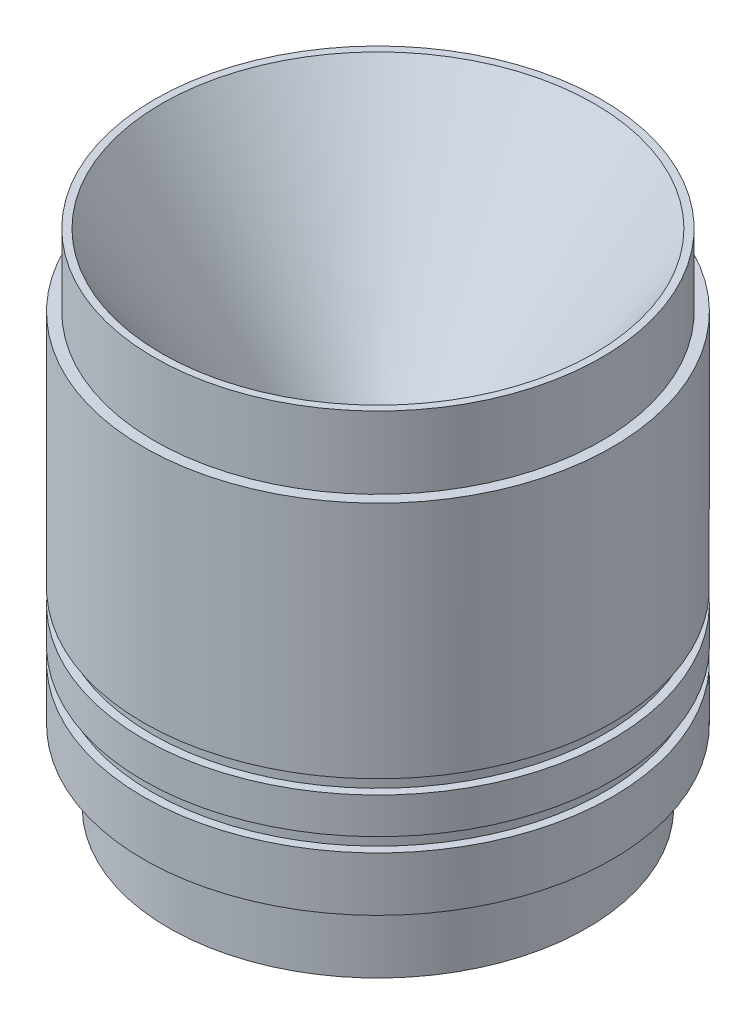
ISO-10303-21;
HEADER;
FILE_DESCRIPTION(('STEP AP214'),'2;1');
FILE_NAME('part.step','',(''),(''),'','','');
FILE_SCHEMA(('AUTOMOTIVE_DESIGN { 1 0 10303 214 1 1 1 1 }'));
ENDSEC;
DATA;
#1=APPLICATION_CONTEXT('core data for automotive mechanical design processes');
#2=APPLICATION_PROTOCOL_DEFINITION('international standard','automotive_design',2000,#1);
#3=PRODUCT_CONTEXT('',#1,'mechanical');
#4=PRODUCT('Part','Part','',(#3));
#5=PRODUCT_RELATED_PRODUCT_CATEGORY('part','',(#4));
#6=PRODUCT_DEFINITION_FORMATION('','',#4);
#7=PRODUCT_DEFINITION_CONTEXT('part definition',#1,'design');
#8=PRODUCT_DEFINITION('design','',#6,#7);
#9=PRODUCT_DEFINITION_SHAPE('','',#8);
#10=(LENGTH_UNIT() NAMED_UNIT(*) SI_UNIT(.MILLI.,.METRE.));
#11=(NAMED_UNIT(*) PLANE_ANGLE_UNIT() SI_UNIT($,.RADIAN.));
#12=(NAMED_UNIT(*) SI_UNIT($,.STERADIAN.) SOLID_ANGLE_UNIT());
#13=UNCERTAINTY_MEASURE_WITH_UNIT(LENGTH_MEASURE(1.E-05),#10,'distance_accuracy_value','');
#14=(GEOMETRIC_REPRESENTATION_CONTEXT(3) GLOBAL_UNCERTAINTY_ASSIGNED_CONTEXT((#13)) GLOBAL_UNIT_ASSIGNED_CONTEXT((#10,
#11,#12)) REPRESENTATION_CONTEXT('',''));
#15=CARTESIAN_POINT('',(0.,0.,0.));
#16=DIRECTION('',(0.,0.,1.));
#17=DIRECTION('',(1.,0.,0.));
#18=AXIS2_PLACEMENT_3D('',#15,#16,#17);
#19=CARTESIAN_POINT('',(0.,60.824555964546,0.));
#20=DIRECTION('',(0.,1.,0.));
#21=DIRECTION('',(-1.,0.,0.));
#22=AXIS2_PLACEMENT_3D('',#19,#20,#21);
#23=CYLINDRICAL_SURFACE('',#22,65.);
#24=CARTESIAN_POINT('',(0.,-54.6410161513773,0.));
#25=DIRECTION('',(0.,1.,0.));
#26=DIRECTION('',(-1.,0.,0.));
#27=AXIS2_PLACEMENT_3D('',#24,#25,#26);
#28=CIRCLE('',#27,65.);
#29=CARTESIAN_POINT('',(-65.,-54.6410161513773,0.));
#30=VERTEX_POINT('',#29);
#31=EDGE_CURVE('E77',#30,#30,#28,.T.);
#32=ORIENTED_EDGE('',*,*,#31,.T.);
#33=EDGE_LOOP('',(#32));
#34=FACE_BOUND('',#33,.T.);
#35=CARTESIAN_POINT('',(0.,-39.6410161513773,0.));
#36=DIRECTION('',(0.,1.,0.));
#37=DIRECTION('',(0.,0.,1.));
#38=AXIS2_PLACEMENT_3D('',#35,#36,#37);
#39=CIRCLE('',#38,65.);
#40=CARTESIAN_POINT('',(0.,-39.6410161513773,65.));
#41=VERTEX_POINT('',#40);
#42=EDGE_CURVE('E89',#41,#41,#39,.T.);
#43=ORIENTED_EDGE('',*,*,#42,.F.);
#44=EDGE_LOOP('',(#43));
#45=FACE_BOUND('',#44,.T.);
#46=ADVANCED_FACE('F45',(#34,#45),#23,.T.);
#47=CARTESIAN_POINT('',(0.,44.3589838486227,0.));
#48=DIRECTION('',(0.,1.,0.));
#49=DIRECTION('',(-1.,0.,0.));
#50=AXIS2_PLACEMENT_3D('',#47,#48,#49);
#51=CIRCLE('',#50,65.);
#52=CARTESIAN_POINT('',(-65.,44.3589838486227,0.));
#53=VERTEX_POINT('',#52);
#54=EDGE_CURVE('E80',#53,#53,#51,.T.);
#55=ORIENTED_EDGE('',*,*,#54,.F.);
#56=EDGE_LOOP('',(#55));
#57=FACE_BOUND('',#56,.T.);
#58=CARTESIAN_POINT('',(0.,-21.8410161513773,0.));
#59=DIRECTION('',(0.,1.,0.));
#60=DIRECTION('',(0.,0.,1.));
#61=AXIS2_PLACEMENT_3D('',#58,#59,#60);
#62=CIRCLE('',#61,65.);
#63=CARTESIAN_POINT('',(0.,-21.8410161513773,65.));
#64=VERTEX_POINT('',#63);
#65=EDGE_CURVE('E100',#64,#64,#62,.T.);
#66=ORIENTED_EDGE('',*,*,#65,.T.);
#67=EDGE_LOOP('',(#66));
#68=FACE_BOUND('',#67,.T.);
#69=ADVANCED_FACE('F128',(#57,#68),#23,.T.);
#70=CARTESIAN_POINT('',(62.,64.3589838486227,0.));
#71=DIRECTION('',(0.,-1.,0.));
#72=DIRECTION('',(1.,0.,0.));
#73=AXIS2_PLACEMENT_3D('',#70,#71,#72);
#74=PLANE('',#73);
#75=CARTESIAN_POINT('',(0.,64.3589838486227,0.));
#76=DIRECTION('',(0.,1.,0.));
#77=DIRECTION('',(-1.,0.,0.));
#78=AXIS2_PLACEMENT_3D('',#75,#76,#77);
#79=CIRCLE('',#78,60.);
#80=CARTESIAN_POINT('',(-60.,64.3589838486227,0.));
#81=VERTEX_POINT('',#80);
#82=EDGE_CURVE('E10',#81,#81,#79,.T.);
#83=ORIENTED_EDGE('',*,*,#82,.F.);
#84=EDGE_LOOP('',(#83));
#85=FACE_BOUND('',#84,.T.);
#86=CARTESIAN_POINT('',(0.,64.3589838486227,0.));
#87=DIRECTION('',(0.,1.,0.));
#88=DIRECTION('',(-1.,0.,0.));
#89=AXIS2_PLACEMENT_3D('',#86,#87,#88);
#90=CIRCLE('',#89,62.);
#91=CARTESIAN_POINT('',(-62.,64.3589838486227,0.));
#92=VERTEX_POINT('',#91);
#93=EDGE_CURVE('E86',#92,#92,#90,.T.);
#94=ORIENTED_EDGE('',*,*,#93,.T.);
#95=EDGE_LOOP('',(#94));
#96=FACE_BOUND('',#95,.T.);
#97=ADVANCED_FACE('F47',(#85,#96),#74,.F.);
#98=CARTESIAN_POINT('',(0.,64.3589838486227,0.));
#99=DIRECTION('',(0.,1.,0.));
#100=DIRECTION('',(-1.,0.,0.));
#101=AXIS2_PLACEMENT_3D('',#98,#99,#100);
#102=CONICAL_SURFACE('',#101,60.,0.610865238198017);
#103=CARTESIAN_POINT('',(0.,5.,0.));
#104=DIRECTION('',(0.,1.,0.));
#105=DIRECTION('',(-1.,0.,0.));
#106=AXIS2_PLACEMENT_3D('',#103,#104,#105);
#107=CIRCLE('',#106,18.4363920487259);
#108=CARTESIAN_POINT('',(-18.4363920487259,4.99999999999999,0.));
#109=VERTEX_POINT('',#108);
#110=EDGE_CURVE('E52',#109,#109,#107,.T.);
#111=CARTESIAN_POINT('',(-18.4363920487259,4.99999999999999,0.));
#112=CARTESIAN_POINT('',(-18.8693462982183,5.61832274842314,0.));
#113=CARTESIAN_POINT('',(-19.3023005477108,6.23664549684629,0.));
#114=CARTESIAN_POINT('',(-20.1682090466956,7.4732909936926,0.));
#115=CARTESIAN_POINT('',(-20.6011632961881,8.09161374211575,0.));
#116=CARTESIAN_POINT('',(-21.4670717951729,9.32825923896206,0.));
#117=CARTESIAN_POINT('',(-21.9000260446654,9.94658198738521,0.));
#118=CARTESIAN_POINT('',(-22.7659345436503,11.1832274842315,0.));
#119=CARTESIAN_POINT('',(-23.1988887931427,11.8015502326547,0.));
#120=CARTESIAN_POINT('',(-24.0647972921276,13.038195729501,0.));
#121=CARTESIAN_POINT('',(-24.49775154162,13.6565184779241,0.));
#122=CARTESIAN_POINT('',(-25.3636600406049,14.8931639747704,0.));
#123=CARTESIAN_POINT('',(-25.7966142900973,15.5114867231936,0.));
#124=CARTESIAN_POINT('',(-26.6625227890822,16.7481322200399,0.));
#125=CARTESIAN_POINT('',(-27.0954770385746,17.366454968463,0.));
#126=CARTESIAN_POINT('',(-27.9613855375595,18.6031004653094,0.));
#127=CARTESIAN_POINT('',(-28.394339787052,19.2214232137325,0.));
#128=CARTESIAN_POINT('',(-29.2602482860368,20.4580687105788,0.));
#129=CARTESIAN_POINT('',(-29.6932025355293,21.076391459002,0.));
#130=CARTESIAN_POINT('',(-30.5591110345142,22.3130369558483,0.));
#131=CARTESIAN_POINT('',(-30.9920652840066,22.9313597042714,0.));
#132=CARTESIAN_POINT('',(-31.8579737829915,24.1680052011177,0.));
#133=CARTESIAN_POINT('',(-32.2909280324839,24.7863279495409,0.));
#134=CARTESIAN_POINT('',(-33.1568365314688,26.0229734463872,0.));
#135=CARTESIAN_POINT('',(-33.5897907809612,26.6412961948103,0.));
#136=CARTESIAN_POINT('',(-34.4556992799461,27.8779416916567,0.));
#137=CARTESIAN_POINT('',(-34.8886535294386,28.4962644400798,0.));
#138=CARTESIAN_POINT('',(-35.7545620284234,29.7329099369261,0.));
#139=CARTESIAN_POINT('',(-36.1875162779159,30.3512326853493,0.));
#140=CARTESIAN_POINT('',(-37.0534247769007,31.5878781821956,0.));
#141=CARTESIAN_POINT('',(-37.4863790263932,32.2062009306187,0.));
#142=CARTESIAN_POINT('',(-38.3522875253781,33.442846427465,0.));
#143=CARTESIAN_POINT('',(-38.7852417748705,34.0611691758882,0.));
#144=CARTESIAN_POINT('',(-39.6511502738554,35.2978146727345,0.));
#145=CARTESIAN_POINT('',(-40.0841045233478,35.9161374211576,0.));
#146=CARTESIAN_POINT('',(-40.9500130223327,37.1527829180039,0.));
#147=CARTESIAN_POINT('',(-41.3829672718251,37.7711056664271,0.));
#148=CARTESIAN_POINT('',(-42.24887577081,39.0077511632734,0.));
#149=CARTESIAN_POINT('',(-42.6818300203025,39.6260739116966,0.));
#150=CARTESIAN_POINT('',(-43.5477385192873,40.8627194085429,0.));
#151=CARTESIAN_POINT('',(-43.9806927687798,41.481042156966,0.));
#152=CARTESIAN_POINT('',(-44.8466012677647,42.7176876538123,0.));
#153=CARTESIAN_POINT('',(-45.2795555172571,43.3360104022355,0.));
#154=CARTESIAN_POINT('',(-46.145464016242,44.5726558990818,0.));
#155=CARTESIAN_POINT('',(-46.5784182657344,45.1909786475049,0.));
#156=CARTESIAN_POINT('',(-47.4443267647193,46.4276241443512,0.));
#157=CARTESIAN_POINT('',(-47.8772810142117,47.0459468927744,0.));
#158=CARTESIAN_POINT('',(-48.7431895131966,48.2825923896207,0.));
#159=CARTESIAN_POINT('',(-49.176143762689,48.9009151380438,0.));
#160=CARTESIAN_POINT('',(-50.0420522616739,50.1375606348902,0.));
#161=CARTESIAN_POINT('',(-50.4750065111664,50.7558833833133,0.));
#162=CARTESIAN_POINT('',(-51.3409150101512,51.9925288801596,0.));
#163=CARTESIAN_POINT('',(-51.7738692596437,52.6108516285828,0.));
#164=CARTESIAN_POINT('',(-52.6397777586286,53.8474971254291,0.));
#165=CARTESIAN_POINT('',(-53.072732008121,54.4658198738522,0.));
#166=CARTESIAN_POINT('',(-53.9386405071059,55.7024653706985,0.));
#167=CARTESIAN_POINT('',(-54.3715947565983,56.3207881191217,0.));
#168=CARTESIAN_POINT('',(-55.2375032555832,57.557433615968,0.));
#169=CARTESIAN_POINT('',(-55.6704575050756,58.1757563643911,0.));
#170=CARTESIAN_POINT('',(-56.5363660040605,59.4124018612374,0.));
#171=CARTESIAN_POINT('',(-56.9693202535529,60.0307246096606,0.));
#172=CARTESIAN_POINT('',(-57.8352287525378,61.2673701065069,0.));
#173=CARTESIAN_POINT('',(-58.2681830020303,61.88569285493,0.));
#174=CARTESIAN_POINT('',(-59.1340915010151,63.1223383517763,0.));
#175=CARTESIAN_POINT('',(-59.5670457505076,63.7406611001995,0.));
#176=CARTESIAN_POINT('',(-60.,64.3589838486227,0.));
#177=B_SPLINE_CURVE_WITH_KNOTS('',3,(#111,#112,#113,#114,#115,#116,#117,#118,#119,#120,#121,
#122,#123,#124,#125,#126,#127,#128,#129,#130,#131,#132,#133,#134,#135,#136,#137,#138,#139,#140,
#141,#142,#143,#144,#145,#146,#147,#148,#149,#150,#151,#152,#153,#154,#155,#156,#157,#158,#159,
#160,#161,#162,#163,#164,#165,#166,#167,#168,#169,#170,#171,#172,#173,#174,#175,#176),
.UNSPECIFIED.,.F.,.F.,(4,2,2,2,2,2,2,2,2,2,2,2,2,2,2,2,2,2,2,2,2,2,2,2,2,2,2,2,2,2,2,2,4),(0.,
2.26449809678439,4.52899619356878,6.79349429035316,9.05799238713755,11.3224904839219,
13.5869885807063,15.8514866774907,18.1159847742751,20.3804828710595,22.6449809678439,
24.9094790646282,27.1739771614126,29.438475258197,31.7029733549814,33.9674714517658,
36.2319695485502,38.4964676453346,40.7609657421189,43.0254638389033,45.2899619356877,
47.5544600324721,49.8189581292565,52.0834562260409,54.3479543228253,56.6124524196096,
58.876950516394,61.1414486131784,63.4059467099628,65.6704448067472,67.9349429035315,
70.1994410003159,72.4639390971003),.UNSPECIFIED.);
#178=EDGE_CURVE('BSEAM210',#109,#81,#177,.T.);
#179=ORIENTED_EDGE('',*,*,#110,.F.);
#180=ORIENTED_EDGE('',*,*,#82,.T.);
#181=ORIENTED_EDGE('',*,*,#178,.T.);
#182=ORIENTED_EDGE('',*,*,#178,.F.);
#183=EDGE_LOOP('',(#179,#181,#180,#182));
#184=FACE_BOUND('',#183,.T.);
#185=ADVANCED_FACE('F210',(#184),#102,.F.);
#186=CARTESIAN_POINT('',(0.,60.824555964546,0.));
#187=DIRECTION('',(0.,1.,0.));
#188=DIRECTION('',(-1.,0.,0.));
#189=AXIS2_PLACEMENT_3D('',#186,#187,#188);
#190=CYLINDRICAL_SURFACE('',#189,18.4363920487259);
#191=CARTESIAN_POINT('',(0.,-5.,0.));
#192=DIRECTION('',(0.,1.,0.));
#193=DIRECTION('',(-1.,0.,0.));
#194=AXIS2_PLACEMENT_3D('',#191,#192,#193);
#195=CIRCLE('',#194,18.4363920487259);
#196=CARTESIAN_POINT('',(-18.4363920487259,-5.00000000000001,0.));
#197=VERTEX_POINT('',#196);
#198=EDGE_CURVE('E56',#197,#197,#195,.T.);
#199=ORIENTED_EDGE('',*,*,#198,.F.);
#200=EDGE_LOOP('',(#199));
#201=FACE_BOUND('',#200,.T.);
#202=ORIENTED_EDGE('',*,*,#110,.T.);
#203=EDGE_LOOP('',(#202));
#204=FACE_BOUND('',#203,.T.);
#205=ADVANCED_FACE('F207',(#201,#204),#190,.F.);
#206=CARTESIAN_POINT('',(0.,-5.,0.));
#207=DIRECTION('',(0.,-1.,0.));
#208=DIRECTION('',(1.,0.,0.));
#209=AXIS2_PLACEMENT_3D('',#206,#207,#208);
#210=CONICAL_SURFACE('',#209,18.4363920487259,0.26179938779915);
#211=CARTESIAN_POINT('',(0.,-79.6410161513773,0.));
#212=DIRECTION('',(0.,1.,0.));
#213=DIRECTION('',(-1.,0.,0.));
#214=AXIS2_PLACEMENT_3D('',#211,#212,#213);
#215=CIRCLE('',#214,38.4363920487259);
#216=CARTESIAN_POINT('',(-38.4363920487259,-79.6410161513773,0.));
#217=VERTEX_POINT('',#216);
#218=EDGE_CURVE('E60',#217,#217,#215,.T.);
#219=ORIENTED_EDGE('',*,*,#218,.F.);
#220=EDGE_LOOP('',(#219));
#221=FACE_BOUND('',#220,.T.);
#222=ORIENTED_EDGE('',*,*,#198,.T.);
#223=EDGE_LOOP('',(#222));
#224=FACE_BOUND('',#223,.T.);
#225=ADVANCED_FACE('F203',(#221,#224),#210,.F.);
#226=CARTESIAN_POINT('',(38.4363920487259,-79.6410161513773,0.));
#227=DIRECTION('',(0.,1.,0.));
#228=DIRECTION('',(-1.,0.,0.));
#229=AXIS2_PLACEMENT_3D('',#226,#227,#228);
#230=PLANE('',#229);
#231=CARTESIAN_POINT('',(0.,-79.6410161513773,0.));
#232=DIRECTION('',(0.,1.,0.));
#233=DIRECTION('',(-1.,0.,0.));
#234=AXIS2_PLACEMENT_3D('',#231,#232,#233);
#235=CIRCLE('',#234,48.);
#236=CARTESIAN_POINT('',(-48.,-79.6410161513773,0.));
#237=VERTEX_POINT('',#236);
#238=EDGE_CURVE('E65',#237,#237,#235,.T.);
#239=ORIENTED_EDGE('',*,*,#238,.F.);
#240=EDGE_LOOP('',(#239));
#241=FACE_BOUND('',#240,.T.);
#242=ORIENTED_EDGE('',*,*,#218,.T.);
#243=EDGE_LOOP('',(#242));
#244=FACE_BOUND('',#243,.T.);
#245=ADVANCED_FACE('F199',(#241,#244),#230,.F.);
#246=CARTESIAN_POINT('',(0.,60.824555964546,0.));
#247=DIRECTION('',(0.,1.,0.));
#248=DIRECTION('',(-1.,0.,0.));
#249=AXIS2_PLACEMENT_3D('',#246,#247,#248);
#250=CYLINDRICAL_SURFACE('',#249,48.);
#251=CARTESIAN_POINT('',(0.,-74.6410161513773,0.));
#252=DIRECTION('',(0.,1.,0.));
#253=DIRECTION('',(-1.,0.,0.));
#254=AXIS2_PLACEMENT_3D('',#251,#252,#253);
#255=CIRCLE('',#254,48.);
#256=CARTESIAN_POINT('',(-48.,-74.6410161513773,0.));
#257=VERTEX_POINT('',#256);
#258=EDGE_CURVE('E68',#257,#257,#255,.T.);
#259=ORIENTED_EDGE('',*,*,#258,.F.);
#260=EDGE_LOOP('',(#259));
#261=FACE_BOUND('',#260,.T.);
#262=ORIENTED_EDGE('',*,*,#238,.T.);
#263=EDGE_LOOP('',(#262));
#264=FACE_BOUND('',#263,.T.);
#265=ADVANCED_FACE('F195',(#261,#264),#250,.T.);
#266=CARTESIAN_POINT('',(48.,-74.6410161513773,0.));
#267=DIRECTION('',(0.,1.,0.));
#268=DIRECTION('',(-1.,0.,0.));
#269=AXIS2_PLACEMENT_3D('',#266,#267,#268);
#270=PLANE('',#269);
#271=CARTESIAN_POINT('',(0.,-74.6410161513773,0.));
#272=DIRECTION('',(0.,1.,0.));
#273=DIRECTION('',(-1.,0.,0.));
#274=AXIS2_PLACEMENT_3D('',#271,#272,#273);
#275=CIRCLE('',#274,58.);
#276=CARTESIAN_POINT('',(-58.,-74.6410161513773,0.));
#277=VERTEX_POINT('',#276);
#278=EDGE_CURVE('E71',#277,#277,#275,.T.);
#279=ORIENTED_EDGE('',*,*,#278,.F.);
#280=EDGE_LOOP('',(#279));
#281=FACE_BOUND('',#280,.T.);
#282=ORIENTED_EDGE('',*,*,#258,.T.);
#283=EDGE_LOOP('',(#282));
#284=FACE_BOUND('',#283,.T.);
#285=ADVANCED_FACE('F187',(#281,#284),#270,.F.);
#286=CARTESIAN_POINT('',(0.,60.824555964546,0.));
#287=DIRECTION('',(0.,1.,0.));
#288=DIRECTION('',(-1.,0.,0.));
#289=AXIS2_PLACEMENT_3D('',#286,#287,#288);
#290=CYLINDRICAL_SURFACE('',#289,58.);
#291=CARTESIAN_POINT('',(0.,-54.6410161513773,0.));
#292=DIRECTION('',(0.,1.,0.));
#293=DIRECTION('',(-1.,0.,0.));
#294=AXIS2_PLACEMENT_3D('',#291,#292,#293);
#295=CIRCLE('',#294,58.);
#296=CARTESIAN_POINT('',(-58.,-54.6410161513773,0.));
#297=VERTEX_POINT('',#296);
#298=EDGE_CURVE('E74',#297,#297,#295,.T.);
#299=ORIENTED_EDGE('',*,*,#298,.F.);
#300=EDGE_LOOP('',(#299));
#301=FACE_BOUND('',#300,.T.);
#302=ORIENTED_EDGE('',*,*,#278,.T.);
#303=EDGE_LOOP('',(#302));
#304=FACE_BOUND('',#303,.T.);
#305=ADVANCED_FACE('F178',(#301,#304),#290,.T.);
#306=CARTESIAN_POINT('',(58.,-54.6410161513773,0.));
#307=DIRECTION('',(0.,1.,0.));
#308=DIRECTION('',(-1.,0.,0.));
#309=AXIS2_PLACEMENT_3D('',#306,#307,#308);
#310=PLANE('',#309);
#311=ORIENTED_EDGE('',*,*,#31,.F.);
#312=EDGE_LOOP('',(#311));
#313=FACE_BOUND('',#312,.T.);
#314=ORIENTED_EDGE('',*,*,#298,.T.);
#315=EDGE_LOOP('',(#314));
#316=FACE_BOUND('',#315,.T.);
#317=ADVANCED_FACE('F173',(#313,#316),#310,.F.);
#318=CARTESIAN_POINT('',(65.,44.3589838486227,0.));
#319=DIRECTION('',(0.,-1.,0.));
#320=DIRECTION('',(1.,0.,0.));
#321=AXIS2_PLACEMENT_3D('',#318,#319,#320);
#322=PLANE('',#321);
#323=CARTESIAN_POINT('',(0.,44.3589838486227,0.));
#324=DIRECTION('',(0.,1.,0.));
#325=DIRECTION('',(-1.,0.,0.));
#326=AXIS2_PLACEMENT_3D('',#323,#324,#325);
#327=CIRCLE('',#326,62.);
#328=CARTESIAN_POINT('',(-62.,44.3589838486227,0.));
#329=VERTEX_POINT('',#328);
#330=EDGE_CURVE('E83',#329,#329,#327,.T.);
#331=ORIENTED_EDGE('',*,*,#330,.F.);
#332=EDGE_LOOP('',(#331));
#333=FACE_BOUND('',#332,.T.);
#334=ORIENTED_EDGE('',*,*,#54,.T.);
#335=EDGE_LOOP('',(#334));
#336=FACE_BOUND('',#335,.T.);
#337=ADVANCED_FACE('F170',(#333,#336),#322,.F.);
#338=CARTESIAN_POINT('',(0.,60.824555964546,0.));
#339=DIRECTION('',(0.,1.,0.));
#340=DIRECTION('',(-1.,0.,0.));
#341=AXIS2_PLACEMENT_3D('',#338,#339,#340);
#342=CYLINDRICAL_SURFACE('',#341,62.);
#343=ORIENTED_EDGE('',*,*,#93,.F.);
#344=EDGE_LOOP('',(#343));
#345=FACE_BOUND('',#344,.T.);
#346=ORIENTED_EDGE('',*,*,#330,.T.);
#347=EDGE_LOOP('',(#346));
#348=FACE_BOUND('',#347,.T.);
#349=ADVANCED_FACE('F156',(#345,#348),#342,.T.);
#350=CARTESIAN_POINT('',(65.,-25.7410161513773,0.));
#351=DIRECTION('',(0.,1.,0.));
#352=DIRECTION('',(0.,0.,1.));
#353=AXIS2_PLACEMENT_3D('',#350,#351,#352);
#354=PLANE('',#353);
#355=CARTESIAN_POINT('',(0.,-25.7410161513773,0.));
#356=DIRECTION('',(0.,1.,0.));
#357=DIRECTION('',(0.,0.,1.));
#358=AXIS2_PLACEMENT_3D('',#355,#356,#357);
#359=CIRCLE('',#358,65.);
#360=CARTESIAN_POINT('',(0.,-25.7410161513773,65.));
#361=VERTEX_POINT('',#360);
#362=EDGE_CURVE('E90',#361,#361,#359,.T.);
#363=ORIENTED_EDGE('',*,*,#362,.T.);
#364=EDGE_LOOP('',(#363));
#365=FACE_BOUND('',#364,.T.);
#366=CARTESIAN_POINT('',(0.,-25.7410161513773,0.));
#367=DIRECTION('',(0.,1.,0.));
#368=DIRECTION('',(0.,0.,1.));
#369=AXIS2_PLACEMENT_3D('',#366,#367,#368);
#370=CIRCLE('',#369,62.7);
#371=CARTESIAN_POINT('',(0.,-25.7410161513773,62.7));
#372=VERTEX_POINT('',#371);
#373=EDGE_CURVE('E94',#372,#372,#370,.T.);
#374=ORIENTED_EDGE('',*,*,#373,.F.);
#375=EDGE_LOOP('',(#374));
#376=FACE_BOUND('',#375,.T.);
#377=ADVANCED_FACE('F153',(#365,#376),#354,.T.);
#378=CARTESIAN_POINT('',(0.,85.8745502258655,0.));
#379=DIRECTION('',(0.,1.,0.));
#380=DIRECTION('',(0.,0.,1.));
#381=AXIS2_PLACEMENT_3D('',#378,#379,#380);
#382=CYLINDRICAL_SURFACE('',#381,62.7);
#383=ORIENTED_EDGE('',*,*,#373,.T.);
#384=EDGE_LOOP('',(#383));
#385=FACE_BOUND('',#384,.T.);
#386=CARTESIAN_POINT('',(0.,-21.8410161513773,0.));
#387=DIRECTION('',(0.,1.,0.));
#388=DIRECTION('',(0.,0.,1.));
#389=AXIS2_PLACEMENT_3D('',#386,#387,#388);
#390=CIRCLE('',#389,62.7);
#391=CARTESIAN_POINT('',(0.,-21.8410161513773,62.7));
#392=VERTEX_POINT('',#391);
#393=EDGE_CURVE('E97',#392,#392,#390,.T.);
#394=ORIENTED_EDGE('',*,*,#393,.F.);
#395=EDGE_LOOP('',(#394));
#396=FACE_BOUND('',#395,.T.);
#397=ADVANCED_FACE('F148',(#385,#396),#382,.T.);
#398=CARTESIAN_POINT('',(62.7,-21.8410161513773,0.));
#399=DIRECTION('',(0.,-1.,0.));
#400=DIRECTION('',(0.,0.,-1.));
#401=AXIS2_PLACEMENT_3D('',#398,#399,#400);
#402=PLANE('',#401);
#403=ORIENTED_EDGE('',*,*,#393,.T.);
#404=EDGE_LOOP('',(#403));
#405=FACE_BOUND('',#404,.T.);
#406=ORIENTED_EDGE('',*,*,#65,.F.);
#407=EDGE_LOOP('',(#406));
#408=FACE_BOUND('',#407,.T.);
#409=ADVANCED_FACE('F139',(#405,#408),#402,.T.);
#410=ORIENTED_EDGE('',*,*,#362,.F.);
#411=EDGE_LOOP('',(#410));
#412=FACE_BOUND('',#411,.T.);
#413=CARTESIAN_POINT('',(0.,-35.7410161513773,0.));
#414=DIRECTION('',(0.,1.,0.));
#415=DIRECTION('',(0.,0.,1.));
#416=AXIS2_PLACEMENT_3D('',#413,#414,#415);
#417=CIRCLE('',#416,65.);
#418=CARTESIAN_POINT('',(0.,-35.7410161513773,65.));
#419=VERTEX_POINT('',#418);
#420=EDGE_CURVE('E93',#419,#419,#417,.T.);
#421=ORIENTED_EDGE('',*,*,#420,.T.);
#422=EDGE_LOOP('',(#421));
#423=FACE_BOUND('',#422,.T.);
#424=ADVANCED_FACE('F114',(#412,#423),#23,.T.);
#425=CARTESIAN_POINT('',(65.,-39.6410161513773,0.));
#426=DIRECTION('',(0.,1.,0.));
#427=DIRECTION('',(0.,0.,1.));
#428=AXIS2_PLACEMENT_3D('',#425,#426,#427);
#429=PLANE('',#428);
#430=ORIENTED_EDGE('',*,*,#42,.T.);
#431=EDGE_LOOP('',(#430));
#432=FACE_BOUND('',#431,.T.);
#433=CARTESIAN_POINT('',(0.,-39.6410161513773,0.));
#434=DIRECTION('',(0.,1.,0.));
#435=DIRECTION('',(0.,0.,1.));
#436=AXIS2_PLACEMENT_3D('',#433,#434,#435);
#437=CIRCLE('',#436,62.7);
#438=CARTESIAN_POINT('',(0.,-39.6410161513773,62.7));
#439=VERTEX_POINT('',#438);
#440=EDGE_CURVE('E105',#439,#439,#437,.T.);
#441=ORIENTED_EDGE('',*,*,#440,.F.);
#442=EDGE_LOOP('',(#441));
#443=FACE_BOUND('',#442,.T.);
#444=ADVANCED_FACE('F124',(#432,#443),#429,.T.);
#445=CARTESIAN_POINT('',(0.,85.8745502258655,0.));
#446=DIRECTION('',(0.,1.,0.));
#447=DIRECTION('',(0.,0.,1.));
#448=AXIS2_PLACEMENT_3D('',#445,#446,#447);
#449=CYLINDRICAL_SURFACE('',#448,62.7);
#450=ORIENTED_EDGE('',*,*,#440,.T.);
#451=EDGE_LOOP('',(#450));
#452=FACE_BOUND('',#451,.T.);
#453=CARTESIAN_POINT('',(0.,-35.7410161513773,0.));
#454=DIRECTION('',(0.,1.,0.));
#455=DIRECTION('',(0.,0.,1.));
#456=AXIS2_PLACEMENT_3D('',#453,#454,#455);
#457=CIRCLE('',#456,62.7);
#458=CARTESIAN_POINT('',(0.,-35.7410161513773,62.7));
#459=VERTEX_POINT('',#458);
#460=EDGE_CURVE('E108',#459,#459,#457,.T.);
#461=ORIENTED_EDGE('',*,*,#460,.F.);
#462=EDGE_LOOP('',(#461));
#463=FACE_BOUND('',#462,.T.);
#464=ADVANCED_FACE('F118',(#452,#463),#449,.T.);
#465=CARTESIAN_POINT('',(62.7,-35.7410161513773,0.));
#466=DIRECTION('',(0.,-1.,0.));
#467=DIRECTION('',(0.,0.,-1.));
#468=AXIS2_PLACEMENT_3D('',#465,#466,#467);
#469=PLANE('',#468);
#470=ORIENTED_EDGE('',*,*,#460,.T.);
#471=EDGE_LOOP('',(#470));
#472=FACE_BOUND('',#471,.T.);
#473=ORIENTED_EDGE('',*,*,#420,.F.);
#474=EDGE_LOOP('',(#473));
#475=FACE_BOUND('',#474,.T.);
#476=ADVANCED_FACE('F116',(#472,#475),#469,.T.);
#477=CLOSED_SHELL('',(#46,#69,#97,#185,#205,#225,#245,#265,#285,#305,#317,#337,#349,#377,#397,
#409,#424,#444,#464,#476));
#478=MANIFOLD_SOLID_BREP('B2',#477);
#479=ADVANCED_BREP_SHAPE_REPRESENTATION('',(#18,#478),#14);
#480=SHAPE_DEFINITION_REPRESENTATION(#9,#479);
ENDSEC;
END-ISO-10303-21;
